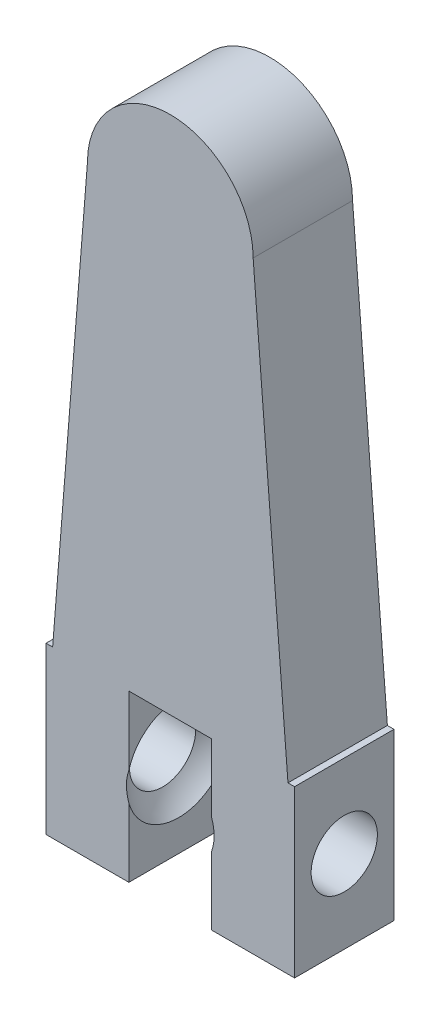
ISO-10303-21;
HEADER;
FILE_DESCRIPTION(('STEP AP214'),'2;1');
FILE_NAME('part.step','',(''),(''),'','','');
FILE_SCHEMA(('AUTOMOTIVE_DESIGN { 1 0 10303 214 1 1 1 1 }'));
ENDSEC;
DATA;
#1=APPLICATION_CONTEXT('core data for automotive mechanical design processes');
#2=APPLICATION_PROTOCOL_DEFINITION('international standard','automotive_design',2000,#1);
#3=PRODUCT_CONTEXT('',#1,'mechanical');
#4=PRODUCT('Part','Part','',(#3));
#5=PRODUCT_RELATED_PRODUCT_CATEGORY('part','',(#4));
#6=PRODUCT_DEFINITION_FORMATION('','',#4);
#7=PRODUCT_DEFINITION_CONTEXT('part definition',#1,'design');
#8=PRODUCT_DEFINITION('design','',#6,#7);
#9=PRODUCT_DEFINITION_SHAPE('','',#8);
#10=(LENGTH_UNIT() NAMED_UNIT(*) SI_UNIT(.MILLI.,.METRE.));
#11=(NAMED_UNIT(*) PLANE_ANGLE_UNIT() SI_UNIT($,.RADIAN.));
#12=(NAMED_UNIT(*) SI_UNIT($,.STERADIAN.) SOLID_ANGLE_UNIT());
#13=UNCERTAINTY_MEASURE_WITH_UNIT(LENGTH_MEASURE(1.E-05),#10,'distance_accuracy_value','');
#14=(GEOMETRIC_REPRESENTATION_CONTEXT(3) GLOBAL_UNCERTAINTY_ASSIGNED_CONTEXT((#13)) GLOBAL_UNIT_ASSIGNED_CONTEXT((#10,
#11,#12)) REPRESENTATION_CONTEXT('',''));
#15=CARTESIAN_POINT('',(0.,0.,0.));
#16=DIRECTION('',(0.,0.,1.));
#17=DIRECTION('',(1.,0.,0.));
#18=AXIS2_PLACEMENT_3D('',#15,#16,#17);
#19=CARTESIAN_POINT('',(-2.5,-36.38301994,6.));
#20=DIRECTION('',(-1.,0.,0.));
#21=DIRECTION('',(0.,0.,1.));
#22=AXIS2_PLACEMENT_3D('',#19,#20,#21);
#23=PLANE('',#22);
#24=CARTESIAN_POINT('',(-2.5,-31.38301994,3.));
#25=DIRECTION('',(-1.,0.,0.));
#26=DIRECTION('',(0.,0.,1.));
#27=AXIS2_PLACEMENT_3D('',#24,#25,#26);
#28=CIRCLE('',#27,3.12249899919919);
#29=CARTESIAN_POINT('',(-2.5,-32.2490453437844,6.));
#30=VERTEX_POINT('',#29);
#31=CARTESIAN_POINT('',(-2.5,-32.2490453437844,0.));
#32=VERTEX_POINT('',#31);
#33=EDGE_CURVE('E49',#30,#32,#28,.F.);
#34=ORIENTED_EDGE('',*,*,#33,.F.);
#35=DIRECTION('',(0.,1.,0.));
#36=VECTOR('',#35,1.);
#37=CARTESIAN_POINT('',(-2.5,-36.38301994,6.));
#38=LINE('',#37,#36);
#39=CARTESIAN_POINT('',(-2.5,-36.38301994,6.));
#40=VERTEX_POINT('',#39);
#41=EDGE_CURVE('E248',#40,#30,#38,.T.);
#42=ORIENTED_EDGE('',*,*,#41,.F.);
#43=DIRECTION('',(0.,0.,-1.));
#44=VECTOR('',#43,1.);
#45=CARTESIAN_POINT('',(-2.5,-36.38301994,6.));
#46=LINE('',#45,#44);
#47=CARTESIAN_POINT('',(-2.5,-36.38301994,0.));
#48=VERTEX_POINT('',#47);
#49=EDGE_CURVE('E201',#40,#48,#46,.T.);
#50=ORIENTED_EDGE('',*,*,#49,.T.);
#51=DIRECTION('',(0.,1.,0.));
#52=VECTOR('',#51,1.);
#53=CARTESIAN_POINT('',(-2.5,-36.38301994,0.));
#54=LINE('',#53,#52);
#55=EDGE_CURVE('E173',#48,#32,#54,.T.);
#56=ORIENTED_EDGE('',*,*,#55,.T.);
#57=EDGE_LOOP('',(#34,#42,#50,#56));
#58=FACE_BOUND('',#57,.T.);
#59=ADVANCED_FACE('F32',(#58),#23,.F.);
#60=CARTESIAN_POINT('',(-2.5,-30.5169945362156,0.));
#61=VERTEX_POINT('',#60);
#62=CARTESIAN_POINT('',(-2.5,-30.5169945362156,6.));
#63=VERTEX_POINT('',#62);
#64=EDGE_CURVE('E232',#61,#63,#28,.F.);
#65=ORIENTED_EDGE('',*,*,#64,.F.);
#66=CARTESIAN_POINT('',(-2.5,-26.38301994,0.));
#67=VERTEX_POINT('',#66);
#68=EDGE_CURVE('E269',#61,#67,#54,.T.);
#69=ORIENTED_EDGE('',*,*,#68,.T.);
#70=DIRECTION('',(0.,0.,-1.));
#71=VECTOR('',#70,1.);
#72=CARTESIAN_POINT('',(-2.5,-26.38301994,6.));
#73=LINE('',#72,#71);
#74=CARTESIAN_POINT('',(-2.5,-26.38301994,6.));
#75=VERTEX_POINT('',#74);
#76=EDGE_CURVE('E198',#75,#67,#73,.T.);
#77=ORIENTED_EDGE('',*,*,#76,.F.);
#78=EDGE_CURVE('E247',#63,#75,#38,.T.);
#79=ORIENTED_EDGE('',*,*,#78,.F.);
#80=EDGE_LOOP('',(#65,#69,#77,#79));
#81=FACE_BOUND('',#80,.T.);
#82=ADVANCED_FACE('F277',(#81),#23,.F.);
#83=CARTESIAN_POINT('',(2.5,-36.38301994,6.));
#84=DIRECTION('',(1.,0.,0.));
#85=DIRECTION('',(0.,0.,-1.));
#86=AXIS2_PLACEMENT_3D('',#83,#84,#85);
#87=PLANE('',#86);
#88=CARTESIAN_POINT('',(2.5,-31.38301994,3.));
#89=DIRECTION('',(1.,0.,0.));
#90=DIRECTION('',(0.,0.,-1.));
#91=AXIS2_PLACEMENT_3D('',#88,#89,#90);
#92=CIRCLE('',#91,3.12249899919919);
#93=CARTESIAN_POINT('',(2.5,-32.2490453437844,0.));
#94=VERTEX_POINT('',#93);
#95=CARTESIAN_POINT('',(2.5,-32.2490453437844,6.));
#96=VERTEX_POINT('',#95);
#97=EDGE_CURVE('E148',#94,#96,#92,.F.);
#98=ORIENTED_EDGE('',*,*,#97,.F.);
#99=DIRECTION('',(0.,-1.,0.));
#100=VECTOR('',#99,1.);
#101=CARTESIAN_POINT('',(2.5,-36.38301994,0.));
#102=LINE('',#101,#100);
#103=CARTESIAN_POINT('',(2.5,-36.38301994,0.));
#104=VERTEX_POINT('',#103);
#105=EDGE_CURVE('E161',#94,#104,#102,.T.);
#106=ORIENTED_EDGE('',*,*,#105,.T.);
#107=DIRECTION('',(0.,0.,-1.));
#108=VECTOR('',#107,1.);
#109=CARTESIAN_POINT('',(2.5,-36.38301994,6.));
#110=LINE('',#109,#108);
#111=CARTESIAN_POINT('',(2.5,-36.38301994,6.));
#112=VERTEX_POINT('',#111);
#113=EDGE_CURVE('E193',#112,#104,#110,.T.);
#114=ORIENTED_EDGE('',*,*,#113,.F.);
#115=DIRECTION('',(0.,-1.,0.));
#116=VECTOR('',#115,1.);
#117=CARTESIAN_POINT('',(2.5,-36.38301994,6.));
#118=LINE('',#117,#116);
#119=EDGE_CURVE('E163',#96,#112,#118,.T.);
#120=ORIENTED_EDGE('',*,*,#119,.F.);
#121=EDGE_LOOP('',(#98,#106,#114,#120));
#122=FACE_BOUND('',#121,.T.);
#123=ADVANCED_FACE('F159',(#122),#87,.F.);
#124=CARTESIAN_POINT('',(2.5,-30.5169945362156,6.));
#125=VERTEX_POINT('',#124);
#126=CARTESIAN_POINT('',(2.5,-30.5169945362156,0.));
#127=VERTEX_POINT('',#126);
#128=EDGE_CURVE('E57',#125,#127,#92,.F.);
#129=ORIENTED_EDGE('',*,*,#128,.F.);
#130=CARTESIAN_POINT('',(2.5,-26.38301994,6.));
#131=VERTEX_POINT('',#130);
#132=EDGE_CURVE('E253',#131,#125,#118,.T.);
#133=ORIENTED_EDGE('',*,*,#132,.F.);
#134=DIRECTION('',(0.,0.,-1.));
#135=VECTOR('',#134,1.);
#136=CARTESIAN_POINT('',(2.5,-26.38301994,6.));
#137=LINE('',#136,#135);
#138=CARTESIAN_POINT('',(2.5,-26.38301994,0.));
#139=VERTEX_POINT('',#138);
#140=EDGE_CURVE('E195',#131,#139,#137,.T.);
#141=ORIENTED_EDGE('',*,*,#140,.T.);
#142=EDGE_CURVE('E170',#139,#127,#102,.T.);
#143=ORIENTED_EDGE('',*,*,#142,.T.);
#144=EDGE_LOOP('',(#129,#133,#141,#143));
#145=FACE_BOUND('',#144,.T.);
#146=ADVANCED_FACE('F285',(#145),#87,.F.);
#147=CARTESIAN_POINT('',(0.,0.,6.));
#148=DIRECTION('',(0.,0.,1.));
#149=DIRECTION('',(1.,0.,0.));
#150=AXIS2_PLACEMENT_3D('',#147,#148,#149);
#151=PLANE('',#150);
#152=ORIENTED_EDGE('',*,*,#41,.T.);
#153=CARTESIAN_POINT('',(0.,-31.38301994,6.));
#154=DIRECTION('',(0.,0.,1.));
#155=DIRECTION('',(1.,0.,0.));
#156=AXIS2_PLACEMENT_3D('',#153,#154,#155);
#157=CIRCLE('',#156,2.64575131106458);
#158=EDGE_CURVE('E229',#30,#63,#157,.F.);
#159=ORIENTED_EDGE('',*,*,#158,.T.);
#160=ORIENTED_EDGE('',*,*,#78,.T.);
#161=DIRECTION('',(1.,0.,0.));
#162=VECTOR('',#161,1.);
#163=CARTESIAN_POINT('',(2.5,-26.38301994,6.));
#164=LINE('',#163,#162);
#165=EDGE_CURVE('E251',#75,#131,#164,.T.);
#166=ORIENTED_EDGE('',*,*,#165,.T.);
#167=ORIENTED_EDGE('',*,*,#132,.T.);
#168=EDGE_CURVE('E164',#125,#96,#157,.F.);
#169=ORIENTED_EDGE('',*,*,#168,.T.);
#170=ORIENTED_EDGE('',*,*,#119,.T.);
#171=DIRECTION('',(1.,0.,0.));
#172=VECTOR('',#171,1.);
#173=CARTESIAN_POINT('',(7.5,-36.38301994,6.));
#174=LINE('',#173,#172);
#175=CARTESIAN_POINT('',(7.5,-36.38301994,6.));
#176=VERTEX_POINT('',#175);
#177=EDGE_CURVE('E256',#112,#176,#174,.T.);
#178=ORIENTED_EDGE('',*,*,#177,.T.);
#179=DIRECTION('',(0.,1.,0.));
#180=VECTOR('',#179,1.);
#181=CARTESIAN_POINT('',(7.5,-36.38301994,6.));
#182=LINE('',#181,#180);
#183=CARTESIAN_POINT('',(7.5,-26.38301994,6.));
#184=VERTEX_POINT('',#183);
#185=EDGE_CURVE('E258',#176,#184,#182,.T.);
#186=ORIENTED_EDGE('',*,*,#185,.T.);
#187=DIRECTION('',(-1.,0.,0.));
#188=VECTOR('',#187,1.);
#189=CARTESIAN_POINT('',(7.5,-26.38301994,6.));
#190=LINE('',#189,#188);
#191=CARTESIAN_POINT('',(7.1016954383645,-26.38301994,6.));
#192=VERTEX_POINT('',#191);
#193=EDGE_CURVE('E187',#184,#192,#190,.T.);
#194=ORIENTED_EDGE('',*,*,#193,.T.);
#195=DIRECTION('',(-0.0794093504420109,0.996842091337629,0.));
#196=VECTOR('',#195,1.);
#197=CARTESIAN_POINT('',(7.1016954383645,-26.38301994,6.));
#198=LINE('',#197,#196);
#199=CARTESIAN_POINT('',(5.,0.,6.));
#200=VERTEX_POINT('',#199);
#201=EDGE_CURVE('E182',#192,#200,#198,.T.);
#202=ORIENTED_EDGE('',*,*,#201,.T.);
#203=CARTESIAN_POINT('',(0.,0.,6.));
#204=DIRECTION('',(0.,0.,1.));
#205=DIRECTION('',(1.,0.,0.));
#206=AXIS2_PLACEMENT_3D('',#203,#204,#205);
#207=CIRCLE('',#206,5.);
#208=CARTESIAN_POINT('',(-5.,0.,6.));
#209=VERTEX_POINT('',#208);
#210=EDGE_CURVE('E237',#200,#209,#207,.T.);
#211=ORIENTED_EDGE('',*,*,#210,.T.);
#212=DIRECTION('',(-0.0794093504420108,-0.996842091337629,0.));
#213=VECTOR('',#212,1.);
#214=CARTESIAN_POINT('',(-7.10169543836449,-26.38301994,6.));
#215=LINE('',#214,#213);
#216=CARTESIAN_POINT('',(-7.10169543836449,-26.38301994,6.));
#217=VERTEX_POINT('',#216);
#218=EDGE_CURVE('E239',#209,#217,#215,.T.);
#219=ORIENTED_EDGE('',*,*,#218,.T.);
#220=DIRECTION('',(-1.,0.,0.));
#221=VECTOR('',#220,1.);
#222=CARTESIAN_POINT('',(-7.5,-26.38301994,6.));
#223=LINE('',#222,#221);
#224=CARTESIAN_POINT('',(-7.5,-26.38301994,6.));
#225=VERTEX_POINT('',#224);
#226=EDGE_CURVE('E241',#217,#225,#223,.T.);
#227=ORIENTED_EDGE('',*,*,#226,.T.);
#228=DIRECTION('',(0.,-1.,0.));
#229=VECTOR('',#228,1.);
#230=CARTESIAN_POINT('',(-7.5,-36.38301994,6.));
#231=LINE('',#230,#229);
#232=CARTESIAN_POINT('',(-7.5,-36.38301994,6.));
#233=VERTEX_POINT('',#232);
#234=EDGE_CURVE('E243',#225,#233,#231,.T.);
#235=ORIENTED_EDGE('',*,*,#234,.T.);
#236=DIRECTION('',(1.,0.,0.));
#237=VECTOR('',#236,1.);
#238=CARTESIAN_POINT('',(-7.5,-36.38301994,6.));
#239=LINE('',#238,#237);
#240=EDGE_CURVE('E245',#233,#40,#239,.T.);
#241=ORIENTED_EDGE('',*,*,#240,.T.);
#242=EDGE_LOOP('',(#152,#159,#160,#166,#167,#169,#170,#178,#186,#194,#202,#211,#219,#227,#235,#241));
#243=FACE_BOUND('',#242,.T.);
#244=ADVANCED_FACE('F288',(#243),#151,.T.);
#245=CARTESIAN_POINT('',(0.,0.,0.));
#246=DIRECTION('',(0.,0.,1.));
#247=DIRECTION('',(1.,0.,0.));
#248=AXIS2_PLACEMENT_3D('',#245,#246,#247);
#249=PLANE('',#248);
#250=CARTESIAN_POINT('',(0.,0.,0.));
#251=DIRECTION('',(0.,0.,1.));
#252=DIRECTION('',(1.,0.,0.));
#253=AXIS2_PLACEMENT_3D('',#250,#251,#252);
#254=CIRCLE('',#253,3.87298334620742);
#255=CARTESIAN_POINT('',(3.87298334620742,0.,0.));
#256=VERTEX_POINT('',#255);
#257=EDGE_CURVE('E214',#256,#256,#254,.T.);
#258=ORIENTED_EDGE('',*,*,#257,.T.);
#259=EDGE_LOOP('',(#258));
#260=FACE_BOUND('',#259,.T.);
#261=CARTESIAN_POINT('',(0.,-31.38301994,0.));
#262=DIRECTION('',(0.,0.,1.));
#263=DIRECTION('',(1.,0.,0.));
#264=AXIS2_PLACEMENT_3D('',#261,#262,#263);
#265=CIRCLE('',#264,2.64575131106458);
#266=EDGE_CURVE('E156',#32,#61,#265,.F.);
#267=ORIENTED_EDGE('',*,*,#266,.F.);
#268=ORIENTED_EDGE('',*,*,#55,.F.);
#269=DIRECTION('',(1.,0.,0.));
#270=VECTOR('',#269,1.);
#271=CARTESIAN_POINT('',(-7.5,-36.38301994,0.));
#272=LINE('',#271,#270);
#273=CARTESIAN_POINT('',(-7.5,-36.38301994,0.));
#274=VERTEX_POINT('',#273);
#275=EDGE_CURVE('E268',#274,#48,#272,.T.);
#276=ORIENTED_EDGE('',*,*,#275,.F.);
#277=DIRECTION('',(0.,-1.,0.));
#278=VECTOR('',#277,1.);
#279=CARTESIAN_POINT('',(-7.5,-36.38301994,0.));
#280=LINE('',#279,#278);
#281=CARTESIAN_POINT('',(-7.5,-26.38301994,0.));
#282=VERTEX_POINT('',#281);
#283=EDGE_CURVE('E266',#282,#274,#280,.T.);
#284=ORIENTED_EDGE('',*,*,#283,.F.);
#285=DIRECTION('',(-1.,0.,0.));
#286=VECTOR('',#285,1.);
#287=CARTESIAN_POINT('',(-7.5,-26.38301994,0.));
#288=LINE('',#287,#286);
#289=CARTESIAN_POINT('',(-7.10169543836449,-26.38301994,0.));
#290=VERTEX_POINT('',#289);
#291=EDGE_CURVE('E264',#290,#282,#288,.T.);
#292=ORIENTED_EDGE('',*,*,#291,.F.);
#293=DIRECTION('',(-0.0794093504420108,-0.996842091337629,0.));
#294=VECTOR('',#293,1.);
#295=CARTESIAN_POINT('',(-7.10169543836449,-26.38301994,0.));
#296=LINE('',#295,#294);
#297=CARTESIAN_POINT('',(-5.,0.,0.));
#298=VERTEX_POINT('',#297);
#299=EDGE_CURVE('E262',#298,#290,#296,.T.);
#300=ORIENTED_EDGE('',*,*,#299,.F.);
#301=CARTESIAN_POINT('',(0.,0.,0.));
#302=DIRECTION('',(0.,0.,1.));
#303=DIRECTION('',(1.,0.,0.));
#304=AXIS2_PLACEMENT_3D('',#301,#302,#303);
#305=CIRCLE('',#304,5.);
#306=CARTESIAN_POINT('',(5.,0.,0.));
#307=VERTEX_POINT('',#306);
#308=EDGE_CURVE('E221',#307,#298,#305,.T.);
#309=ORIENTED_EDGE('',*,*,#308,.F.);
#310=DIRECTION('',(-0.0794093504420109,0.996842091337629,0.));
#311=VECTOR('',#310,1.);
#312=CARTESIAN_POINT('',(7.1016954383645,-26.38301994,0.));
#313=LINE('',#312,#311);
#314=CARTESIAN_POINT('',(7.1016954383645,-26.38301994,0.));
#315=VERTEX_POINT('',#314);
#316=EDGE_CURVE('E216',#315,#307,#313,.T.);
#317=ORIENTED_EDGE('',*,*,#316,.F.);
#318=DIRECTION('',(-1.,0.,0.));
#319=VECTOR('',#318,1.);
#320=CARTESIAN_POINT('',(7.5,-26.38301994,0.));
#321=LINE('',#320,#319);
#322=CARTESIAN_POINT('',(7.5,-26.38301994,0.));
#323=VERTEX_POINT('',#322);
#324=EDGE_CURVE('E180',#323,#315,#321,.T.);
#325=ORIENTED_EDGE('',*,*,#324,.F.);
#326=DIRECTION('',(0.,1.,0.));
#327=VECTOR('',#326,1.);
#328=CARTESIAN_POINT('',(7.5,-36.38301994,0.));
#329=LINE('',#328,#327);
#330=CARTESIAN_POINT('',(7.5,-36.38301994,0.));
#331=VERTEX_POINT('',#330);
#332=EDGE_CURVE('E178',#331,#323,#329,.T.);
#333=ORIENTED_EDGE('',*,*,#332,.F.);
#334=DIRECTION('',(1.,0.,0.));
#335=VECTOR('',#334,1.);
#336=CARTESIAN_POINT('',(7.5,-36.38301994,0.));
#337=LINE('',#336,#335);
#338=EDGE_CURVE('E169',#104,#331,#337,.T.);
#339=ORIENTED_EDGE('',*,*,#338,.F.);
#340=ORIENTED_EDGE('',*,*,#105,.F.);
#341=EDGE_CURVE('E144',#127,#94,#265,.F.);
#342=ORIENTED_EDGE('',*,*,#341,.F.);
#343=ORIENTED_EDGE('',*,*,#142,.F.);
#344=DIRECTION('',(1.,0.,0.));
#345=VECTOR('',#344,1.);
#346=CARTESIAN_POINT('',(2.5,-26.38301994,0.));
#347=LINE('',#346,#345);
#348=EDGE_CURVE('E171',#67,#139,#347,.T.);
#349=ORIENTED_EDGE('',*,*,#348,.F.);
#350=ORIENTED_EDGE('',*,*,#68,.F.);
#351=EDGE_LOOP('',(#267,#268,#276,#284,#292,#300,#309,#317,#325,#333,#339,#340,#342,#343,#349,#350));
#352=FACE_BOUND('',#351,.T.);
#353=ADVANCED_FACE('F167',(#260,#352),#249,.F.);
#354=CARTESIAN_POINT('',(-7.5,-31.38301994,3.));
#355=DIRECTION('',(1.,0.,0.));
#356=DIRECTION('',(0.,0.,-1.));
#357=AXIS2_PLACEMENT_3D('',#354,#355,#356);
#358=CYLINDRICAL_SURFACE('',#357,2.);
#359=CARTESIAN_POINT('',(7.5,-31.38301994,3.));
#360=DIRECTION('',(1.,0.,0.));
#361=DIRECTION('',(0.,0.,-1.));
#362=AXIS2_PLACEMENT_3D('',#359,#360,#361);
#363=CIRCLE('',#362,2.);
#364=CARTESIAN_POINT('',(7.5,-31.38301994,1.));
#365=VERTEX_POINT('',#364);
#366=EDGE_CURVE('E224',#365,#365,#363,.T.);
#367=ORIENTED_EDGE('',*,*,#366,.T.);
#368=EDGE_LOOP('',(#367));
#369=FACE_BOUND('',#368,.T.);
#370=CARTESIAN_POINT('',(3.46410161513775,-31.38301994,3.));
#371=DIRECTION('',(-1.,0.,0.));
#372=DIRECTION('',(0.,0.,1.));
#373=AXIS2_PLACEMENT_3D('',#370,#371,#372);
#374=CIRCLE('',#373,2.);
#375=CARTESIAN_POINT('',(3.46410161513775,-31.38301994,5.));
#376=VERTEX_POINT('',#375);
#377=EDGE_CURVE('E154',#376,#376,#374,.F.);
#378=ORIENTED_EDGE('',*,*,#377,.F.);
#379=EDGE_LOOP('',(#378));
#380=FACE_BOUND('',#379,.T.);
#381=ADVANCED_FACE('F301',(#369,#380),#358,.F.);
#382=CARTESIAN_POINT('',(-7.5,-31.38301994,3.));
#383=DIRECTION('',(1.,0.,0.));
#384=DIRECTION('',(0.,0.,-1.));
#385=AXIS2_PLACEMENT_3D('',#382,#383,#384);
#386=CIRCLE('',#385,2.);
#387=CARTESIAN_POINT('',(-7.5,-31.38301994,1.));
#388=VERTEX_POINT('',#387);
#389=EDGE_CURVE('E217',#388,#388,#386,.T.);
#390=ORIENTED_EDGE('',*,*,#389,.F.);
#391=EDGE_LOOP('',(#390));
#392=FACE_BOUND('',#391,.T.);
#393=CARTESIAN_POINT('',(-3.46410161513775,-31.38301994,3.));
#394=DIRECTION('',(1.,0.,0.));
#395=DIRECTION('',(0.,0.,-1.));
#396=AXIS2_PLACEMENT_3D('',#393,#394,#395);
#397=CIRCLE('',#396,2.);
#398=CARTESIAN_POINT('',(-3.46410161513775,-31.38301994,1.));
#399=VERTEX_POINT('',#398);
#400=EDGE_CURVE('E36',#399,#399,#397,.F.);
#401=ORIENTED_EDGE('',*,*,#400,.F.);
#402=EDGE_LOOP('',(#401));
#403=FACE_BOUND('',#402,.T.);
#404=ADVANCED_FACE('F299',(#392,#403),#358,.F.);
#405=CARTESIAN_POINT('',(7.1016954383645,-26.38301994,6.));
#406=DIRECTION('',(-0.996842091337629,-0.0794093504420109,0.));
#407=DIRECTION('',(0.0794093504420109,-0.996842091337629,0.));
#408=AXIS2_PLACEMENT_3D('',#405,#406,#407);
#409=PLANE('',#408);
#410=ORIENTED_EDGE('',*,*,#316,.T.);
#411=DIRECTION('',(0.,0.,-1.));
#412=VECTOR('',#411,1.);
#413=CARTESIAN_POINT('',(5.,0.,6.));
#414=LINE('',#413,#412);
#415=EDGE_CURVE('E11',#200,#307,#414,.T.);
#416=ORIENTED_EDGE('',*,*,#415,.F.);
#417=ORIENTED_EDGE('',*,*,#201,.F.);
#418=DIRECTION('',(0.,0.,-1.));
#419=VECTOR('',#418,1.);
#420=CARTESIAN_POINT('',(7.1016954383645,-26.38301994,6.));
#421=LINE('',#420,#419);
#422=EDGE_CURVE('E183',#192,#315,#421,.T.);
#423=ORIENTED_EDGE('',*,*,#422,.T.);
#424=EDGE_LOOP('',(#410,#416,#417,#423));
#425=FACE_BOUND('',#424,.T.);
#426=ADVANCED_FACE('F34',(#425),#409,.F.);
#427=CARTESIAN_POINT('',(0.,0.,6.));
#428=DIRECTION('',(0.,0.,-1.));
#429=DIRECTION('',(-1.,0.,0.));
#430=AXIS2_PLACEMENT_3D('',#427,#428,#429);
#431=CYLINDRICAL_SURFACE('',#430,5.);
#432=ORIENTED_EDGE('',*,*,#308,.T.);
#433=DIRECTION('',(0.,0.,-1.));
#434=VECTOR('',#433,1.);
#435=CARTESIAN_POINT('',(-5.,0.,6.));
#436=LINE('',#435,#434);
#437=EDGE_CURVE('E41',#209,#298,#436,.T.);
#438=ORIENTED_EDGE('',*,*,#437,.F.);
#439=ORIENTED_EDGE('',*,*,#210,.F.);
#440=ORIENTED_EDGE('',*,*,#415,.T.);
#441=EDGE_LOOP('',(#432,#438,#439,#440));
#442=FACE_BOUND('',#441,.T.);
#443=ADVANCED_FACE('F308',(#442),#431,.T.);
#444=CARTESIAN_POINT('',(-7.10169543836449,-26.38301994,6.));
#445=DIRECTION('',(0.996842091337629,-0.0794093504420108,0.));
#446=DIRECTION('',(0.0794093504420108,0.996842091337629,0.));
#447=AXIS2_PLACEMENT_3D('',#444,#445,#446);
#448=PLANE('',#447);
#449=ORIENTED_EDGE('',*,*,#299,.T.);
#450=DIRECTION('',(0.,0.,-1.));
#451=VECTOR('',#450,1.);
#452=CARTESIAN_POINT('',(-7.10169543836449,-26.38301994,6.));
#453=LINE('',#452,#451);
#454=EDGE_CURVE('E210',#217,#290,#453,.T.);
#455=ORIENTED_EDGE('',*,*,#454,.F.);
#456=ORIENTED_EDGE('',*,*,#218,.F.);
#457=ORIENTED_EDGE('',*,*,#437,.T.);
#458=EDGE_LOOP('',(#449,#455,#456,#457));
#459=FACE_BOUND('',#458,.T.);
#460=ADVANCED_FACE('F331',(#459),#448,.F.);
#461=CARTESIAN_POINT('',(-7.5,-26.38301994,6.));
#462=DIRECTION('',(0.,-1.,0.));
#463=DIRECTION('',(0.,0.,-1.));
#464=AXIS2_PLACEMENT_3D('',#461,#462,#463);
#465=PLANE('',#464);
#466=ORIENTED_EDGE('',*,*,#291,.T.);
#467=DIRECTION('',(0.,0.,-1.));
#468=VECTOR('',#467,1.);
#469=CARTESIAN_POINT('',(-7.5,-26.38301994,6.));
#470=LINE('',#469,#468);
#471=EDGE_CURVE('E207',#225,#282,#470,.T.);
#472=ORIENTED_EDGE('',*,*,#471,.F.);
#473=ORIENTED_EDGE('',*,*,#226,.F.);
#474=ORIENTED_EDGE('',*,*,#454,.T.);
#475=EDGE_LOOP('',(#466,#472,#473,#474));
#476=FACE_BOUND('',#475,.T.);
#477=ADVANCED_FACE('F328',(#476),#465,.F.);
#478=CARTESIAN_POINT('',(-7.5,-36.38301994,6.));
#479=DIRECTION('',(1.,0.,0.));
#480=DIRECTION('',(0.,0.,-1.));
#481=AXIS2_PLACEMENT_3D('',#478,#479,#480);
#482=PLANE('',#481);
#483=ORIENTED_EDGE('',*,*,#389,.T.);
#484=EDGE_LOOP('',(#483));
#485=FACE_BOUND('',#484,.T.);
#486=ORIENTED_EDGE('',*,*,#283,.T.);
#487=DIRECTION('',(0.,0.,-1.));
#488=VECTOR('',#487,1.);
#489=CARTESIAN_POINT('',(-7.5,-36.38301994,6.));
#490=LINE('',#489,#488);
#491=EDGE_CURVE('E204',#233,#274,#490,.T.);
#492=ORIENTED_EDGE('',*,*,#491,.F.);
#493=ORIENTED_EDGE('',*,*,#234,.F.);
#494=ORIENTED_EDGE('',*,*,#471,.T.);
#495=EDGE_LOOP('',(#486,#492,#493,#494));
#496=FACE_BOUND('',#495,.T.);
#497=ADVANCED_FACE('F324',(#485,#496),#482,.F.);
#498=CARTESIAN_POINT('',(-7.5,-36.38301994,6.));
#499=DIRECTION('',(0.,1.,0.));
#500=DIRECTION('',(0.,0.,1.));
#501=AXIS2_PLACEMENT_3D('',#498,#499,#500);
#502=PLANE('',#501);
#503=ORIENTED_EDGE('',*,*,#275,.T.);
#504=ORIENTED_EDGE('',*,*,#49,.F.);
#505=ORIENTED_EDGE('',*,*,#240,.F.);
#506=ORIENTED_EDGE('',*,*,#491,.T.);
#507=EDGE_LOOP('',(#503,#504,#505,#506));
#508=FACE_BOUND('',#507,.T.);
#509=ADVANCED_FACE('F321',(#508),#502,.F.);
#510=CARTESIAN_POINT('',(2.5,-26.38301994,6.));
#511=DIRECTION('',(0.,1.,0.));
#512=DIRECTION('',(0.,0.,1.));
#513=AXIS2_PLACEMENT_3D('',#510,#511,#512);
#514=PLANE('',#513);
#515=ORIENTED_EDGE('',*,*,#348,.T.);
#516=ORIENTED_EDGE('',*,*,#140,.F.);
#517=ORIENTED_EDGE('',*,*,#165,.F.);
#518=ORIENTED_EDGE('',*,*,#76,.T.);
#519=EDGE_LOOP('',(#515,#516,#517,#518));
#520=FACE_BOUND('',#519,.T.);
#521=ADVANCED_FACE('F282',(#520),#514,.F.);
#522=CARTESIAN_POINT('',(7.5,-36.38301994,6.));
#523=DIRECTION('',(0.,1.,0.));
#524=DIRECTION('',(0.,0.,1.));
#525=AXIS2_PLACEMENT_3D('',#522,#523,#524);
#526=PLANE('',#525);
#527=ORIENTED_EDGE('',*,*,#338,.T.);
#528=DIRECTION('',(0.,0.,-1.));
#529=VECTOR('',#528,1.);
#530=CARTESIAN_POINT('',(7.5,-36.38301994,6.));
#531=LINE('',#530,#529);
#532=EDGE_CURVE('E190',#176,#331,#531,.T.);
#533=ORIENTED_EDGE('',*,*,#532,.F.);
#534=ORIENTED_EDGE('',*,*,#177,.F.);
#535=ORIENTED_EDGE('',*,*,#113,.T.);
#536=EDGE_LOOP('',(#527,#533,#534,#535));
#537=FACE_BOUND('',#536,.T.);
#538=ADVANCED_FACE('F368',(#537),#526,.F.);
#539=CARTESIAN_POINT('',(7.5,-36.38301994,6.));
#540=DIRECTION('',(-1.,0.,0.));
#541=DIRECTION('',(0.,0.,1.));
#542=AXIS2_PLACEMENT_3D('',#539,#540,#541);
#543=PLANE('',#542);
#544=ORIENTED_EDGE('',*,*,#366,.F.);
#545=EDGE_LOOP('',(#544));
#546=FACE_BOUND('',#545,.T.);
#547=ORIENTED_EDGE('',*,*,#332,.T.);
#548=DIRECTION('',(0.,0.,-1.));
#549=VECTOR('',#548,1.);
#550=CARTESIAN_POINT('',(7.5,-26.38301994,6.));
#551=LINE('',#550,#549);
#552=EDGE_CURVE('E186',#184,#323,#551,.T.);
#553=ORIENTED_EDGE('',*,*,#552,.F.);
#554=ORIENTED_EDGE('',*,*,#185,.F.);
#555=ORIENTED_EDGE('',*,*,#532,.T.);
#556=EDGE_LOOP('',(#547,#553,#554,#555));
#557=FACE_BOUND('',#556,.T.);
#558=ADVANCED_FACE('F364',(#546,#557),#543,.F.);
#559=CARTESIAN_POINT('',(7.5,-26.38301994,6.));
#560=DIRECTION('',(0.,-1.,0.));
#561=DIRECTION('',(0.,0.,-1.));
#562=AXIS2_PLACEMENT_3D('',#559,#560,#561);
#563=PLANE('',#562);
#564=ORIENTED_EDGE('',*,*,#324,.T.);
#565=ORIENTED_EDGE('',*,*,#422,.F.);
#566=ORIENTED_EDGE('',*,*,#193,.F.);
#567=ORIENTED_EDGE('',*,*,#552,.T.);
#568=EDGE_LOOP('',(#564,#565,#566,#567));
#569=FACE_BOUND('',#568,.T.);
#570=ADVANCED_FACE('F360',(#569),#563,.F.);
#571=CARTESIAN_POINT('',(0.,0.,1.));
#572=DIRECTION('',(0.,0.,-1.));
#573=DIRECTION('',(0.,-1.,0.));
#574=AXIS2_PLACEMENT_3D('',#571,#572,#573);
#575=SPHERICAL_SURFACE('',#574,4.);
#576=ORIENTED_EDGE('',*,*,#257,.F.);
#577=EDGE_LOOP('',(#576));
#578=FACE_BOUND('',#577,.T.);
#579=ADVANCED_FACE('F390',(#578),#575,.F.);
#580=CARTESIAN_POINT('',(0.,-31.38301994,3.));
#581=DIRECTION('',(0.,0.,1.));
#582=DIRECTION('',(0.,1.,0.));
#583=AXIS2_PLACEMENT_3D('',#580,#581,#582);
#584=SPHERICAL_SURFACE('',#583,3.99999999999999);
#585=ORIENTED_EDGE('',*,*,#33,.T.);
#586=ORIENTED_EDGE('',*,*,#266,.T.);
#587=ORIENTED_EDGE('',*,*,#64,.T.);
#588=ORIENTED_EDGE('',*,*,#158,.F.);
#589=EDGE_LOOP('',(#585,#586,#587,#588));
#590=FACE_BOUND('',#589,.T.);
#591=ORIENTED_EDGE('',*,*,#400,.T.);
#592=EDGE_LOOP('',(#591));
#593=FACE_BOUND('',#592,.T.);
#594=ADVANCED_FACE('F297',(#590,#593),#584,.F.);
#595=ORIENTED_EDGE('',*,*,#128,.T.);
#596=ORIENTED_EDGE('',*,*,#341,.T.);
#597=ORIENTED_EDGE('',*,*,#97,.T.);
#598=ORIENTED_EDGE('',*,*,#168,.F.);
#599=EDGE_LOOP('',(#595,#596,#597,#598));
#600=FACE_BOUND('',#599,.T.);
#601=ORIENTED_EDGE('',*,*,#377,.T.);
#602=EDGE_LOOP('',(#601));
#603=FACE_BOUND('',#602,.T.);
#604=ADVANCED_FACE('F146',(#600,#603),#584,.F.);
#605=CLOSED_SHELL('',(#59,#82,#123,#146,#244,#353,#381,#404,#426,#443,#460,#477,#497,#509,#521,
#538,#558,#570,#579,#594,#604));
#606=MANIFOLD_SOLID_BREP('B2',#605);
#607=ADVANCED_BREP_SHAPE_REPRESENTATION('',(#18,#606),#14);
#608=SHAPE_DEFINITION_REPRESENTATION(#9,#607);
ENDSEC;
END-ISO-10303-21;
